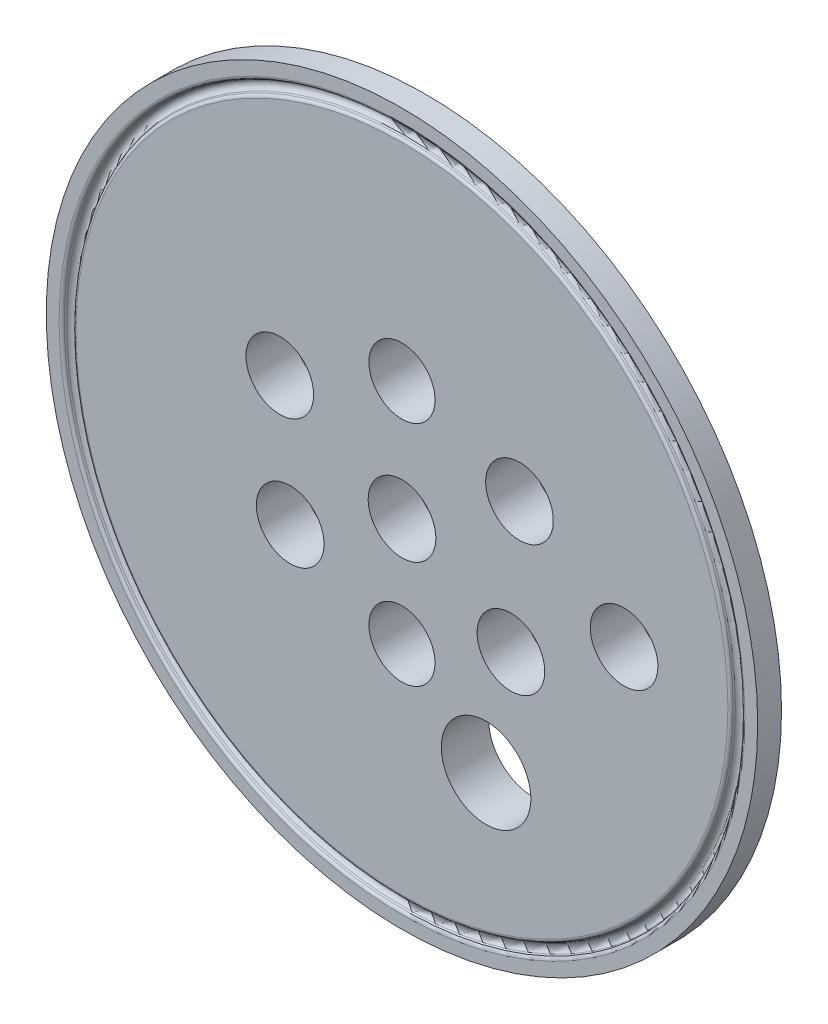
ISO-10303-21;
HEADER;
FILE_DESCRIPTION(('STEP AP214'),'2;1');
FILE_NAME('part.step','',(''),(''),'','','');
FILE_SCHEMA(('AUTOMOTIVE_DESIGN { 1 0 10303 214 1 1 1 1 }'));
ENDSEC;
DATA;
#1=APPLICATION_CONTEXT('core data for automotive mechanical design processes');
#2=APPLICATION_PROTOCOL_DEFINITION('international standard','automotive_design',2000,#1);
#3=PRODUCT_CONTEXT('',#1,'mechanical');
#4=PRODUCT('Part','Part','',(#3));
#5=PRODUCT_RELATED_PRODUCT_CATEGORY('part','',(#4));
#6=PRODUCT_DEFINITION_FORMATION('','',#4);
#7=PRODUCT_DEFINITION_CONTEXT('part definition',#1,'design');
#8=PRODUCT_DEFINITION('design','',#6,#7);
#9=PRODUCT_DEFINITION_SHAPE('','',#8);
#10=(LENGTH_UNIT() NAMED_UNIT(*) SI_UNIT(.MILLI.,.METRE.));
#11=(NAMED_UNIT(*) PLANE_ANGLE_UNIT() SI_UNIT($,.RADIAN.));
#12=(NAMED_UNIT(*) SI_UNIT($,.STERADIAN.) SOLID_ANGLE_UNIT());
#13=UNCERTAINTY_MEASURE_WITH_UNIT(LENGTH_MEASURE(1.E-05),#10,'distance_accuracy_value','');
#14=(GEOMETRIC_REPRESENTATION_CONTEXT(3) GLOBAL_UNCERTAINTY_ASSIGNED_CONTEXT((#13)) GLOBAL_UNIT_ASSIGNED_CONTEXT((#10,
#11,#12)) REPRESENTATION_CONTEXT('',''));
#15=CARTESIAN_POINT('',(0.,0.,0.));
#16=DIRECTION('',(0.,0.,1.));
#17=DIRECTION('',(1.,0.,0.));
#18=AXIS2_PLACEMENT_3D('',#15,#16,#17);
#19=CARTESIAN_POINT('',(0.,68.2954539594501,-11.0998));
#20=DIRECTION('',(0.,0.,1.));
#21=DIRECTION('',(1.,0.,0.));
#22=AXIS2_PLACEMENT_3D('',#19,#20,#21);
#23=PLANE('',#22);
#24=CARTESIAN_POINT('',(25.5524346969857,-14.3083948325037,-11.0998));
#25=DIRECTION('',(0.,0.,-1.));
#26=DIRECTION('',(-1.,0.,0.));
#27=AXIS2_PLACEMENT_3D('',#24,#25,#26);
#28=CIRCLE('',#27,7.9375);
#29=CARTESIAN_POINT('',(17.6149346969857,-14.3083948325037,-11.0998));
#30=VERTEX_POINT('',#29);
#31=EDGE_CURVE('E114',#30,#30,#28,.T.);
#32=ORIENTED_EDGE('',*,*,#31,.F.);
#33=EDGE_LOOP('',(#32));
#34=FACE_BOUND('',#33,.T.);
#35=CARTESIAN_POINT('',(-26.2226936329588,-14.3083948325037,-11.0998));
#36=DIRECTION('',(0.,0.,-1.));
#37=DIRECTION('',(-1.,0.,0.));
#38=AXIS2_PLACEMENT_3D('',#35,#36,#37);
#39=CIRCLE('',#38,7.9375);
#40=CARTESIAN_POINT('',(-34.1601936329588,-14.3083948325037,-11.0998));
#41=VERTEX_POINT('',#40);
#42=EDGE_CURVE('E99',#41,#41,#39,.T.);
#43=ORIENTED_EDGE('',*,*,#42,.F.);
#44=EDGE_LOOP('',(#43));
#45=FACE_BOUND('',#44,.T.);
#46=CARTESIAN_POINT('',(0.,27.9765569002959,-11.0998));
#47=DIRECTION('',(0.,0.,-1.));
#48=DIRECTION('',(-1.,0.,0.));
#49=AXIS2_PLACEMENT_3D('',#46,#47,#48);
#50=CIRCLE('',#49,7.75);
#51=CARTESIAN_POINT('',(-7.75,27.9765569002959,-11.0998));
#52=VERTEX_POINT('',#51);
#53=EDGE_CURVE('E98',#52,#52,#50,.T.);
#54=ORIENTED_EDGE('',*,*,#53,.F.);
#55=EDGE_LOOP('',(#54));
#56=FACE_BOUND('',#55,.T.);
#57=CARTESIAN_POINT('',(52.0919580563692,0.,-11.0998));
#58=DIRECTION('',(0.,0.,-1.));
#59=DIRECTION('',(-1.,0.,0.));
#60=AXIS2_PLACEMENT_3D('',#57,#58,#59);
#61=CIRCLE('',#60,7.9375);
#62=CARTESIAN_POINT('',(44.1544580563692,0.,-11.0998));
#63=VERTEX_POINT('',#62);
#64=EDGE_CURVE('E90',#63,#63,#61,.T.);
#65=ORIENTED_EDGE('',*,*,#64,.F.);
#66=EDGE_LOOP('',(#65));
#67=FACE_BOUND('',#66,.T.);
#68=CARTESIAN_POINT('',(19.7252434936329,-41.7547506337078,-11.0998));
#69=DIRECTION('',(0.,0.,-1.));
#70=DIRECTION('',(-1.,0.,0.));
#71=AXIS2_PLACEMENT_3D('',#68,#69,#70);
#72=CIRCLE('',#71,10.5);
#73=CARTESIAN_POINT('',(9.22524349363294,-41.7547506337078,-11.0998));
#74=VERTEX_POINT('',#73);
#75=EDGE_CURVE('E115',#74,#74,#72,.T.);
#76=ORIENTED_EDGE('',*,*,#75,.F.);
#77=EDGE_LOOP('',(#76));
#78=FACE_BOUND('',#77,.T.);
#79=CARTESIAN_POINT('',(0.,-25.4243269783356,-11.0998));
#80=DIRECTION('',(0.,0.,-1.));
#81=DIRECTION('',(-1.,0.,0.));
#82=AXIS2_PLACEMENT_3D('',#79,#80,#81);
#83=CIRCLE('',#82,7.75);
#84=CARTESIAN_POINT('',(-7.75,-25.4243269783356,-11.0998));
#85=VERTEX_POINT('',#84);
#86=EDGE_CURVE('E146',#85,#85,#83,.T.);
#87=ORIENTED_EDGE('',*,*,#86,.F.);
#88=EDGE_LOOP('',(#87));
#89=FACE_BOUND('',#88,.T.);
#90=CARTESIAN_POINT('',(27.5560509363296,17.3336449438203,-11.0998));
#91=DIRECTION('',(0.,0.,-1.));
#92=DIRECTION('',(-1.,0.,0.));
#93=AXIS2_PLACEMENT_3D('',#90,#91,#92);
#94=CIRCLE('',#93,7.9375);
#95=CARTESIAN_POINT('',(19.6185509363296,17.3336449438203,-11.0998));
#96=VERTEX_POINT('',#95);
#97=EDGE_CURVE('E138',#96,#96,#94,.T.);
#98=ORIENTED_EDGE('',*,*,#97,.F.);
#99=EDGE_LOOP('',(#98));
#100=FACE_BOUND('',#99,.T.);
#101=CARTESIAN_POINT('',(-28.655279995636,14.7871655334011,-11.0998));
#102=DIRECTION('',(0.,0.,-1.));
#103=DIRECTION('',(-1.,0.,0.));
#104=AXIS2_PLACEMENT_3D('',#101,#102,#103);
#105=CIRCLE('',#104,7.9375);
#106=CARTESIAN_POINT('',(-36.592779995636,14.7871655334011,-11.0998));
#107=VERTEX_POINT('',#106);
#108=EDGE_CURVE('E130',#107,#107,#105,.T.);
#109=ORIENTED_EDGE('',*,*,#108,.F.);
#110=EDGE_LOOP('',(#109));
#111=FACE_BOUND('',#110,.T.);
#112=CARTESIAN_POINT('',(0.,0.,-11.0998));
#113=DIRECTION('',(0.,0.,-1.));
#114=DIRECTION('',(-1.,0.,0.));
#115=AXIS2_PLACEMENT_3D('',#112,#113,#114);
#116=CIRCLE('',#115,7.9375);
#117=CARTESIAN_POINT('',(-7.9375,0.,-11.0998));
#118=VERTEX_POINT('',#117);
#119=EDGE_CURVE('E86',#118,#118,#116,.T.);
#120=ORIENTED_EDGE('',*,*,#119,.F.);
#121=EDGE_LOOP('',(#120));
#122=FACE_BOUND('',#121,.T.);
#123=CARTESIAN_POINT('',(0.,0.,-11.0998));
#124=DIRECTION('',(0.,0.,1.));
#125=DIRECTION('',(1.,0.,0.));
#126=AXIS2_PLACEMENT_3D('',#123,#124,#125);
#127=CIRCLE('',#126,68.2954539594501);
#128=CARTESIAN_POINT('',(68.2954539594501,0.,-11.0998));
#129=VERTEX_POINT('',#128);
#130=EDGE_CURVE('E10',#129,#129,#127,.T.);
#131=ORIENTED_EDGE('',*,*,#130,.F.);
#132=EDGE_LOOP('',(#131));
#133=FACE_BOUND('',#132,.T.);
#134=ADVANCED_FACE('F42',(#34,#45,#56,#67,#78,#89,#100,#111,#122,#133),#23,.F.);
#135=CARTESIAN_POINT('',(0.,0.,-11.0998));
#136=DIRECTION('',(0.,0.,1.));
#137=DIRECTION('',(1.,0.,0.));
#138=AXIS2_PLACEMENT_3D('',#135,#136,#137);
#139=CONICAL_SURFACE('',#138,68.2954539594501,1.22173047639603);
#140=CARTESIAN_POINT('',(0.,0.,-5.588));
#141=DIRECTION('',(0.,0.,1.));
#142=DIRECTION('',(1.,0.,0.));
#143=AXIS2_PLACEMENT_3D('',#140,#141,#142);
#144=CIRCLE('',#143,83.439);
#145=CARTESIAN_POINT('',(83.439,0.,-5.588));
#146=VERTEX_POINT('',#145);
#147=EDGE_CURVE('E49',#146,#146,#144,.T.);
#148=ORIENTED_EDGE('',*,*,#147,.F.);
#149=EDGE_LOOP('',(#148));
#150=FACE_BOUND('',#149,.T.);
#151=ORIENTED_EDGE('',*,*,#130,.T.);
#152=EDGE_LOOP('',(#151));
#153=FACE_BOUND('',#152,.T.);
#154=ADVANCED_FACE('F162',(#150,#153),#139,.T.);
#155=CARTESIAN_POINT('',(0.,0.,0.));
#156=DIRECTION('',(0.,0.,1.));
#157=DIRECTION('',(1.,0.,0.));
#158=AXIS2_PLACEMENT_3D('',#155,#156,#157);
#159=CYLINDRICAL_SURFACE('',#158,83.439);
#160=CARTESIAN_POINT('',(0.,0.,0.));
#161=DIRECTION('',(0.,0.,1.));
#162=DIRECTION('',(1.,0.,0.));
#163=AXIS2_PLACEMENT_3D('',#160,#161,#162);
#164=CIRCLE('',#163,83.439);
#165=CARTESIAN_POINT('',(83.439,0.,0.));
#166=VERTEX_POINT('',#165);
#167=EDGE_CURVE('E54',#166,#166,#164,.T.);
#168=ORIENTED_EDGE('',*,*,#167,.F.);
#169=EDGE_LOOP('',(#168));
#170=FACE_BOUND('',#169,.T.);
#171=ORIENTED_EDGE('',*,*,#147,.T.);
#172=EDGE_LOOP('',(#171));
#173=FACE_BOUND('',#172,.T.);
#174=ADVANCED_FACE('F216',(#170,#173),#159,.T.);
#175=CARTESIAN_POINT('',(0.,80.4257722747395,0.));
#176=DIRECTION('',(0.,0.,-1.));
#177=DIRECTION('',(-1.,0.,0.));
#178=AXIS2_PLACEMENT_3D('',#175,#176,#177);
#179=PLANE('',#178);
#180=CARTESIAN_POINT('',(0.,0.,0.));
#181=DIRECTION('',(0.,0.,1.));
#182=DIRECTION('',(1.,0.,0.));
#183=AXIS2_PLACEMENT_3D('',#180,#181,#182);
#184=CIRCLE('',#183,80.4257722747395);
#185=CARTESIAN_POINT('',(80.4257722747395,0.,0.));
#186=VERTEX_POINT('',#185);
#187=EDGE_CURVE('E59',#186,#186,#184,.T.);
#188=ORIENTED_EDGE('',*,*,#187,.F.);
#189=EDGE_LOOP('',(#188));
#190=FACE_BOUND('',#189,.T.);
#191=ORIENTED_EDGE('',*,*,#167,.T.);
#192=EDGE_LOOP('',(#191));
#193=FACE_BOUND('',#192,.T.);
#194=ADVANCED_FACE('F212',(#190,#193),#179,.F.);
#195=CARTESIAN_POINT('',(0.,0.,-0.7874));
#196=DIRECTION('',(0.,0.,1.));
#197=DIRECTION('',(1.,0.,0.));
#198=AXIS2_PLACEMENT_3D('',#195,#196,#197);
#199=TOROIDAL_SURFACE('',#198,80.4257722747395,0.787400000000004);
#200=CARTESIAN_POINT('',(0.,0.,-0.479738309427544));
#201=DIRECTION('',(0.,0.,1.));
#202=DIRECTION('',(1.,0.,0.));
#203=AXIS2_PLACEMENT_3D('',#200,#201,#202);
#204=CIRCLE('',#203,79.700966753131);
#205=CARTESIAN_POINT('',(79.700966753131,0.,-0.479738309427544));
#206=VERTEX_POINT('',#205);
#207=EDGE_CURVE('E65',#206,#206,#204,.T.);
#208=ORIENTED_EDGE('',*,*,#207,.F.);
#209=EDGE_LOOP('',(#208));
#210=FACE_BOUND('',#209,.T.);
#211=ORIENTED_EDGE('',*,*,#187,.T.);
#212=EDGE_LOOP('',(#211));
#213=FACE_BOUND('',#212,.T.);
#214=ADVANCED_FACE('F208',(#210,#213),#199,.T.);
#215=CARTESIAN_POINT('',(0.,0.,-0.479738309427544));
#216=DIRECTION('',(0.,0.,1.));
#217=DIRECTION('',(1.,0.,0.));
#218=AXIS2_PLACEMENT_3D('',#215,#216,#217);
#219=CONICAL_SURFACE('',#218,79.700966753131,0.40142572795866);
#220=CARTESIAN_POINT('',(0.,0.,-0.872854821190487));
#221=DIRECTION('',(0.,0.,1.));
#222=DIRECTION('',(1.,0.,0.));
#223=AXIS2_PLACEMENT_3D('',#220,#221,#222);
#224=CIRCLE('',#223,79.5340986940515);
#225=CARTESIAN_POINT('',(79.5340986940515,0.,-0.872854821190487));
#226=VERTEX_POINT('',#225);
#227=EDGE_CURVE('E69',#226,#226,#224,.T.);
#228=ORIENTED_EDGE('',*,*,#227,.F.);
#229=EDGE_LOOP('',(#228));
#230=FACE_BOUND('',#229,.T.);
#231=ORIENTED_EDGE('',*,*,#207,.T.);
#232=EDGE_LOOP('',(#231));
#233=FACE_BOUND('',#232,.T.);
#234=ADVANCED_FACE('F204',(#230,#233),#219,.F.);
#235=CARTESIAN_POINT('',(0.,0.,-0.4064));
#236=DIRECTION('',(0.,0.,1.));
#237=DIRECTION('',(1.,0.,0.));
#238=AXIS2_PLACEMENT_3D('',#235,#236,#237);
#239=TOROIDAL_SURFACE('',#238,78.4352,1.1938);
#240=CARTESIAN_POINT('',(0.,0.,-0.872854821190497));
#241=DIRECTION('',(0.,0.,1.));
#242=DIRECTION('',(1.,0.,0.));
#243=AXIS2_PLACEMENT_3D('',#240,#241,#242);
#244=CIRCLE('',#243,77.3363013059485);
#245=CARTESIAN_POINT('',(77.3363013059485,0.,-0.872854821190497));
#246=VERTEX_POINT('',#245);
#247=EDGE_CURVE('E73',#246,#246,#244,.T.);
#248=ORIENTED_EDGE('',*,*,#247,.F.);
#249=EDGE_LOOP('',(#248));
#250=FACE_BOUND('',#249,.T.);
#251=ORIENTED_EDGE('',*,*,#227,.T.);
#252=EDGE_LOOP('',(#251));
#253=FACE_BOUND('',#252,.T.);
#254=ADVANCED_FACE('F200',(#250,#253),#239,.F.);
#255=CARTESIAN_POINT('',(0.,0.,-0.872854821190497));
#256=DIRECTION('',(0.,0.,-1.));
#257=DIRECTION('',(-1.,0.,0.));
#258=AXIS2_PLACEMENT_3D('',#255,#256,#257);
#259=CONICAL_SURFACE('',#258,77.3363013059485,0.401425727958679);
#260=CARTESIAN_POINT('',(0.,0.,-0.479738309427542));
#261=DIRECTION('',(0.,0.,1.));
#262=DIRECTION('',(1.,0.,0.));
#263=AXIS2_PLACEMENT_3D('',#260,#261,#262);
#264=CIRCLE('',#263,77.1694332468689);
#265=CARTESIAN_POINT('',(77.1694332468689,0.,-0.479738309427542));
#266=VERTEX_POINT('',#265);
#267=EDGE_CURVE('E77',#266,#266,#264,.T.);
#268=ORIENTED_EDGE('',*,*,#267,.F.);
#269=EDGE_LOOP('',(#268));
#270=FACE_BOUND('',#269,.T.);
#271=ORIENTED_EDGE('',*,*,#247,.T.);
#272=EDGE_LOOP('',(#271));
#273=FACE_BOUND('',#272,.T.);
#274=ADVANCED_FACE('F196',(#270,#273),#259,.T.);
#275=CARTESIAN_POINT('',(0.,0.,-0.7874));
#276=DIRECTION('',(0.,0.,1.));
#277=DIRECTION('',(1.,0.,0.));
#278=AXIS2_PLACEMENT_3D('',#275,#276,#277);
#279=TOROIDAL_SURFACE('',#278,76.4446277252605,0.787399999999998);
#280=CARTESIAN_POINT('',(0.,0.,0.));
#281=DIRECTION('',(0.,0.,1.));
#282=DIRECTION('',(1.,0.,0.));
#283=AXIS2_PLACEMENT_3D('',#280,#281,#282);
#284=CIRCLE('',#283,76.4446277252605);
#285=CARTESIAN_POINT('',(76.4446277252605,0.,0.));
#286=VERTEX_POINT('',#285);
#287=EDGE_CURVE('E81',#286,#286,#284,.T.);
#288=ORIENTED_EDGE('',*,*,#287,.F.);
#289=EDGE_LOOP('',(#288));
#290=FACE_BOUND('',#289,.T.);
#291=ORIENTED_EDGE('',*,*,#267,.T.);
#292=EDGE_LOOP('',(#291));
#293=FACE_BOUND('',#292,.T.);
#294=ADVANCED_FACE('F186',(#290,#293),#279,.T.);
#295=CARTESIAN_POINT('',(0.,0.,0.));
#296=DIRECTION('',(0.,0.,-1.));
#297=DIRECTION('',(-1.,0.,0.));
#298=AXIS2_PLACEMENT_3D('',#295,#296,#297);
#299=PLANE('',#298);
#300=CARTESIAN_POINT('',(25.5524346969857,-14.3083948325037,0.));
#301=DIRECTION('',(0.,0.,-1.));
#302=DIRECTION('',(-1.,0.,0.));
#303=AXIS2_PLACEMENT_3D('',#300,#301,#302);
#304=CIRCLE('',#303,7.9375);
#305=CARTESIAN_POINT('',(17.6149346969857,-14.3083948325037,0.));
#306=VERTEX_POINT('',#305);
#307=EDGE_CURVE('E110',#306,#306,#304,.T.);
#308=ORIENTED_EDGE('',*,*,#307,.T.);
#309=EDGE_LOOP('',(#308));
#310=FACE_BOUND('',#309,.T.);
#311=CARTESIAN_POINT('',(-26.2226936329588,-14.3083948325037,0.));
#312=DIRECTION('',(0.,0.,-1.));
#313=DIRECTION('',(-1.,0.,0.));
#314=AXIS2_PLACEMENT_3D('',#311,#312,#313);
#315=CIRCLE('',#314,7.9375);
#316=CARTESIAN_POINT('',(-34.1601936329588,-14.3083948325037,0.));
#317=VERTEX_POINT('',#316);
#318=EDGE_CURVE('E119',#317,#317,#315,.T.);
#319=ORIENTED_EDGE('',*,*,#318,.T.);
#320=EDGE_LOOP('',(#319));
#321=FACE_BOUND('',#320,.T.);
#322=CARTESIAN_POINT('',(0.,27.9765569002959,0.));
#323=DIRECTION('',(0.,0.,-1.));
#324=DIRECTION('',(-1.,0.,0.));
#325=AXIS2_PLACEMENT_3D('',#322,#323,#324);
#326=CIRCLE('',#325,7.75);
#327=CARTESIAN_POINT('',(-7.75,27.9765569002959,0.));
#328=VERTEX_POINT('',#327);
#329=EDGE_CURVE('E94',#328,#328,#326,.T.);
#330=ORIENTED_EDGE('',*,*,#329,.T.);
#331=EDGE_LOOP('',(#330));
#332=FACE_BOUND('',#331,.T.);
#333=CARTESIAN_POINT('',(52.0919580563692,0.,0.));
#334=DIRECTION('',(0.,0.,-1.));
#335=DIRECTION('',(-1.,0.,0.));
#336=AXIS2_PLACEMENT_3D('',#333,#334,#335);
#337=CIRCLE('',#336,7.9375);
#338=CARTESIAN_POINT('',(44.1544580563692,0.,0.));
#339=VERTEX_POINT('',#338);
#340=EDGE_CURVE('E103',#339,#339,#337,.T.);
#341=ORIENTED_EDGE('',*,*,#340,.T.);
#342=EDGE_LOOP('',(#341));
#343=FACE_BOUND('',#342,.T.);
#344=CARTESIAN_POINT('',(19.7252434936329,-41.7547506337078,0.));
#345=DIRECTION('',(0.,0.,-1.));
#346=DIRECTION('',(-1.,0.,0.));
#347=AXIS2_PLACEMENT_3D('',#344,#345,#346);
#348=CIRCLE('',#347,10.5);
#349=CARTESIAN_POINT('',(9.22524349363294,-41.7547506337078,0.));
#350=VERTEX_POINT('',#349);
#351=EDGE_CURVE('E150',#350,#350,#348,.T.);
#352=ORIENTED_EDGE('',*,*,#351,.T.);
#353=EDGE_LOOP('',(#352));
#354=FACE_BOUND('',#353,.T.);
#355=CARTESIAN_POINT('',(0.,-25.4243269783356,0.));
#356=DIRECTION('',(0.,0.,-1.));
#357=DIRECTION('',(-1.,0.,0.));
#358=AXIS2_PLACEMENT_3D('',#355,#356,#357);
#359=CIRCLE('',#358,7.75);
#360=CARTESIAN_POINT('',(-7.75,-25.4243269783356,0.));
#361=VERTEX_POINT('',#360);
#362=EDGE_CURVE('E142',#361,#361,#359,.T.);
#363=ORIENTED_EDGE('',*,*,#362,.T.);
#364=EDGE_LOOP('',(#363));
#365=FACE_BOUND('',#364,.T.);
#366=CARTESIAN_POINT('',(27.5560509363296,17.3336449438203,0.));
#367=DIRECTION('',(0.,0.,-1.));
#368=DIRECTION('',(-1.,0.,0.));
#369=AXIS2_PLACEMENT_3D('',#366,#367,#368);
#370=CIRCLE('',#369,7.9375);
#371=CARTESIAN_POINT('',(19.6185509363296,17.3336449438203,0.));
#372=VERTEX_POINT('',#371);
#373=EDGE_CURVE('E134',#372,#372,#370,.T.);
#374=ORIENTED_EDGE('',*,*,#373,.T.);
#375=EDGE_LOOP('',(#374));
#376=FACE_BOUND('',#375,.T.);
#377=CARTESIAN_POINT('',(-28.655279995636,14.7871655334011,0.));
#378=DIRECTION('',(0.,0.,-1.));
#379=DIRECTION('',(-1.,0.,0.));
#380=AXIS2_PLACEMENT_3D('',#377,#378,#379);
#381=CIRCLE('',#380,7.9375);
#382=CARTESIAN_POINT('',(-36.592779995636,14.7871655334011,0.));
#383=VERTEX_POINT('',#382);
#384=EDGE_CURVE('E126',#383,#383,#381,.T.);
#385=ORIENTED_EDGE('',*,*,#384,.T.);
#386=EDGE_LOOP('',(#385));
#387=FACE_BOUND('',#386,.T.);
#388=CARTESIAN_POINT('',(0.,0.,0.));
#389=DIRECTION('',(0.,0.,-1.));
#390=DIRECTION('',(-1.,0.,0.));
#391=AXIS2_PLACEMENT_3D('',#388,#389,#390);
#392=CIRCLE('',#391,7.9375);
#393=CARTESIAN_POINT('',(-7.9375,0.,0.));
#394=VERTEX_POINT('',#393);
#395=EDGE_CURVE('E85',#394,#394,#392,.T.);
#396=ORIENTED_EDGE('',*,*,#395,.T.);
#397=EDGE_LOOP('',(#396));
#398=FACE_BOUND('',#397,.T.);
#399=ORIENTED_EDGE('',*,*,#287,.T.);
#400=EDGE_LOOP('',(#399));
#401=FACE_BOUND('',#400,.T.);
#402=ADVANCED_FACE('F176',(#310,#321,#332,#343,#354,#365,#376,#387,#398,#401),#299,.F.);
#403=CARTESIAN_POINT('',(0.,0.,0.));
#404=DIRECTION('',(0.,0.,-1.));
#405=DIRECTION('',(-1.,0.,0.));
#406=AXIS2_PLACEMENT_3D('',#403,#404,#405);
#407=CYLINDRICAL_SURFACE('',#406,7.9375);
#408=ORIENTED_EDGE('',*,*,#395,.F.);
#409=EDGE_LOOP('',(#408));
#410=FACE_BOUND('',#409,.T.);
#411=ORIENTED_EDGE('',*,*,#119,.T.);
#412=EDGE_LOOP('',(#411));
#413=FACE_BOUND('',#412,.T.);
#414=ADVANCED_FACE('F173',(#410,#413),#407,.F.);
#415=CARTESIAN_POINT('',(-28.655279995636,14.7871655334011,0.));
#416=DIRECTION('',(0.,0.,-1.));
#417=DIRECTION('',(-1.,0.,0.));
#418=AXIS2_PLACEMENT_3D('',#415,#416,#417);
#419=CYLINDRICAL_SURFACE('',#418,7.9375);
#420=ORIENTED_EDGE('',*,*,#384,.F.);
#421=EDGE_LOOP('',(#420));
#422=FACE_BOUND('',#421,.T.);
#423=ORIENTED_EDGE('',*,*,#108,.T.);
#424=EDGE_LOOP('',(#423));
#425=FACE_BOUND('',#424,.T.);
#426=ADVANCED_FACE('F175',(#422,#425),#419,.F.);
#427=CARTESIAN_POINT('',(27.5560509363296,17.3336449438203,0.));
#428=DIRECTION('',(0.,0.,-1.));
#429=DIRECTION('',(-1.,0.,0.));
#430=AXIS2_PLACEMENT_3D('',#427,#428,#429);
#431=CYLINDRICAL_SURFACE('',#430,7.9375);
#432=ORIENTED_EDGE('',*,*,#373,.F.);
#433=EDGE_LOOP('',(#432));
#434=FACE_BOUND('',#433,.T.);
#435=ORIENTED_EDGE('',*,*,#97,.T.);
#436=EDGE_LOOP('',(#435));
#437=FACE_BOUND('',#436,.T.);
#438=ADVANCED_FACE('F183',(#434,#437),#431,.F.);
#439=CARTESIAN_POINT('',(0.,-25.4243269783356,0.));
#440=DIRECTION('',(0.,0.,-1.));
#441=DIRECTION('',(-1.,0.,0.));
#442=AXIS2_PLACEMENT_3D('',#439,#440,#441);
#443=CYLINDRICAL_SURFACE('',#442,7.75);
#444=ORIENTED_EDGE('',*,*,#362,.F.);
#445=EDGE_LOOP('',(#444));
#446=FACE_BOUND('',#445,.T.);
#447=ORIENTED_EDGE('',*,*,#86,.T.);
#448=EDGE_LOOP('',(#447));
#449=FACE_BOUND('',#448,.T.);
#450=ADVANCED_FACE('F281',(#446,#449),#443,.F.);
#451=CARTESIAN_POINT('',(19.7252434936329,-41.7547506337078,0.));
#452=DIRECTION('',(0.,0.,-1.));
#453=DIRECTION('',(-1.,0.,0.));
#454=AXIS2_PLACEMENT_3D('',#451,#452,#453);
#455=CYLINDRICAL_SURFACE('',#454,10.5);
#456=ORIENTED_EDGE('',*,*,#351,.F.);
#457=EDGE_LOOP('',(#456));
#458=FACE_BOUND('',#457,.T.);
#459=ORIENTED_EDGE('',*,*,#75,.T.);
#460=EDGE_LOOP('',(#459));
#461=FACE_BOUND('',#460,.T.);
#462=ADVANCED_FACE('F158',(#458,#461),#455,.F.);
#463=CARTESIAN_POINT('',(52.0919580563692,0.,0.));
#464=DIRECTION('',(0.,0.,-1.));
#465=DIRECTION('',(-1.,0.,0.));
#466=AXIS2_PLACEMENT_3D('',#463,#464,#465);
#467=CYLINDRICAL_SURFACE('',#466,7.9375);
#468=ORIENTED_EDGE('',*,*,#340,.F.);
#469=EDGE_LOOP('',(#468));
#470=FACE_BOUND('',#469,.T.);
#471=ORIENTED_EDGE('',*,*,#64,.T.);
#472=EDGE_LOOP('',(#471));
#473=FACE_BOUND('',#472,.T.);
#474=ADVANCED_FACE('F302',(#470,#473),#467,.F.);
#475=CARTESIAN_POINT('',(0.,27.9765569002959,0.));
#476=DIRECTION('',(0.,0.,-1.));
#477=DIRECTION('',(-1.,0.,0.));
#478=AXIS2_PLACEMENT_3D('',#475,#476,#477);
#479=CYLINDRICAL_SURFACE('',#478,7.75);
#480=ORIENTED_EDGE('',*,*,#329,.F.);
#481=EDGE_LOOP('',(#480));
#482=FACE_BOUND('',#481,.T.);
#483=ORIENTED_EDGE('',*,*,#53,.T.);
#484=EDGE_LOOP('',(#483));
#485=FACE_BOUND('',#484,.T.);
#486=ADVANCED_FACE('F191',(#482,#485),#479,.F.);
#487=CARTESIAN_POINT('',(-26.2226936329588,-14.3083948325037,0.));
#488=DIRECTION('',(0.,0.,-1.));
#489=DIRECTION('',(-1.,0.,0.));
#490=AXIS2_PLACEMENT_3D('',#487,#488,#489);
#491=CYLINDRICAL_SURFACE('',#490,7.9375);
#492=ORIENTED_EDGE('',*,*,#318,.F.);
#493=EDGE_LOOP('',(#492));
#494=FACE_BOUND('',#493,.T.);
#495=ORIENTED_EDGE('',*,*,#42,.T.);
#496=EDGE_LOOP('',(#495));
#497=FACE_BOUND('',#496,.T.);
#498=ADVANCED_FACE('F322',(#494,#497),#491,.F.);
#499=CARTESIAN_POINT('',(25.5524346969857,-14.3083948325037,0.));
#500=DIRECTION('',(0.,0.,-1.));
#501=DIRECTION('',(-1.,0.,0.));
#502=AXIS2_PLACEMENT_3D('',#499,#500,#501);
#503=CYLINDRICAL_SURFACE('',#502,7.9375);
#504=ORIENTED_EDGE('',*,*,#307,.F.);
#505=EDGE_LOOP('',(#504));
#506=FACE_BOUND('',#505,.T.);
#507=ORIENTED_EDGE('',*,*,#31,.T.);
#508=EDGE_LOOP('',(#507));
#509=FACE_BOUND('',#508,.T.);
#510=ADVANCED_FACE('F332',(#506,#509),#503,.F.);
#511=CLOSED_SHELL('',(#134,#154,#174,#194,#214,#234,#254,#274,#294,#402,#414,#426,#438,#450,
#462,#474,#486,#498,#510));
#512=MANIFOLD_SOLID_BREP('B2',#511);
#513=ADVANCED_BREP_SHAPE_REPRESENTATION('',(#18,#512),#14);
#514=SHAPE_DEFINITION_REPRESENTATION(#9,#513);
ENDSEC;
END-ISO-10303-21;
